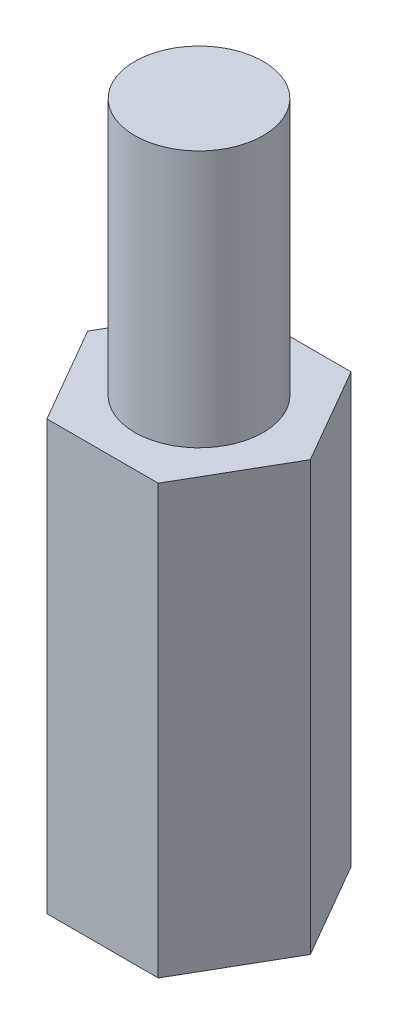
ISO-10303-21;
HEADER;
FILE_DESCRIPTION(('STEP AP214'),'2;1');
FILE_NAME('part.step','',(''),(''),'','','');
FILE_SCHEMA(('AUTOMOTIVE_DESIGN { 1 0 10303 214 1 1 1 1 }'));
ENDSEC;
DATA;
#1=APPLICATION_CONTEXT('core data for automotive mechanical design processes');
#2=APPLICATION_PROTOCOL_DEFINITION('international standard','automotive_design',2000,#1);
#3=PRODUCT_CONTEXT('',#1,'mechanical');
#4=PRODUCT('Part','Part','',(#3));
#5=PRODUCT_RELATED_PRODUCT_CATEGORY('part','',(#4));
#6=PRODUCT_DEFINITION_FORMATION('','',#4);
#7=PRODUCT_DEFINITION_CONTEXT('part definition',#1,'design');
#8=PRODUCT_DEFINITION('design','',#6,#7);
#9=PRODUCT_DEFINITION_SHAPE('','',#8);
#10=(LENGTH_UNIT() NAMED_UNIT(*) SI_UNIT(.MILLI.,.METRE.));
#11=(NAMED_UNIT(*) PLANE_ANGLE_UNIT() SI_UNIT($,.RADIAN.));
#12=(NAMED_UNIT(*) SI_UNIT($,.STERADIAN.) SOLID_ANGLE_UNIT());
#13=UNCERTAINTY_MEASURE_WITH_UNIT(LENGTH_MEASURE(1.E-05),#10,'distance_accuracy_value','');
#14=(GEOMETRIC_REPRESENTATION_CONTEXT(3) GLOBAL_UNCERTAINTY_ASSIGNED_CONTEXT((#13)) GLOBAL_UNIT_ASSIGNED_CONTEXT((#10,
#11,#12)) REPRESENTATION_CONTEXT('',''));
#15=CARTESIAN_POINT('',(0.,0.,0.));
#16=DIRECTION('',(0.,0.,1.));
#17=DIRECTION('',(1.,0.,0.));
#18=AXIS2_PLACEMENT_3D('',#15,#16,#17);
#19=CARTESIAN_POINT('',(0.,10.,0.));
#20=DIRECTION('',(0.,1.,0.));
#21=DIRECTION('',(0.,0.,1.));
#22=AXIS2_PLACEMENT_3D('',#19,#20,#21);
#23=PLANE('',#22);
#24=DIRECTION('',(0.5,0.,-0.866025403784439));
#25=VECTOR('',#24,1.);
#26=CARTESIAN_POINT('',(1.29903810567665,10.,2.25000000000001));
#27=LINE('',#26,#25);
#28=CARTESIAN_POINT('',(1.29903810567665,10.,2.25000000000001));
#29=VERTEX_POINT('',#28);
#30=CARTESIAN_POINT('',(2.59807621135331,10.,0.));
#31=VERTEX_POINT('',#30);
#32=EDGE_CURVE('E130',#29,#31,#27,.T.);
#33=ORIENTED_EDGE('',*,*,#32,.T.);
#34=DIRECTION('',(-0.499999999999999,0.,-0.866025403784439));
#35=VECTOR('',#34,1.);
#36=CARTESIAN_POINT('',(2.59807621135331,10.,0.));
#37=LINE('',#36,#35);
#38=CARTESIAN_POINT('',(1.29903810567665,10.,-2.25000000000001));
#39=VERTEX_POINT('',#38);
#40=EDGE_CURVE('E85',#31,#39,#37,.T.);
#41=ORIENTED_EDGE('',*,*,#40,.T.);
#42=DIRECTION('',(-1.,0.,0.));
#43=VECTOR('',#42,1.);
#44=CARTESIAN_POINT('',(1.29903810567665,10.,-2.25000000000001));
#45=LINE('',#44,#43);
#46=CARTESIAN_POINT('',(-1.29903810567666,10.,-2.25000000000001));
#47=VERTEX_POINT('',#46);
#48=EDGE_CURVE('E98',#39,#47,#45,.T.);
#49=ORIENTED_EDGE('',*,*,#48,.T.);
#50=DIRECTION('',(-0.5,0.,0.866025403784438));
#51=VECTOR('',#50,1.);
#52=CARTESIAN_POINT('',(-1.29903810567666,10.,-2.25000000000001));
#53=LINE('',#52,#51);
#54=CARTESIAN_POINT('',(-2.59807621135332,10.,0.));
#55=VERTEX_POINT('',#54);
#56=EDGE_CURVE('E92',#47,#55,#53,.T.);
#57=ORIENTED_EDGE('',*,*,#56,.T.);
#58=DIRECTION('',(0.500000000000001,0.,0.866025403784438));
#59=VECTOR('',#58,1.);
#60=CARTESIAN_POINT('',(-2.59807621135332,10.,0.));
#61=LINE('',#60,#59);
#62=CARTESIAN_POINT('',(-1.29903810567666,10.,2.25000000000001));
#63=VERTEX_POINT('',#62);
#64=EDGE_CURVE('E96',#55,#63,#61,.T.);
#65=ORIENTED_EDGE('',*,*,#64,.T.);
#66=DIRECTION('',(1.,0.,0.));
#67=VECTOR('',#66,1.);
#68=CARTESIAN_POINT('',(-1.29903810567666,10.,2.25000000000001));
#69=LINE('',#68,#67);
#70=EDGE_CURVE('E50',#63,#29,#69,.T.);
#71=ORIENTED_EDGE('',*,*,#70,.T.);
#72=EDGE_LOOP('',(#33,#41,#49,#57,#65,#71));
#73=FACE_BOUND('',#72,.T.);
#74=CARTESIAN_POINT('',(0.,10.,0.));
#75=DIRECTION('',(0.,1.,0.));
#76=DIRECTION('',(0.,0.,1.));
#77=AXIS2_PLACEMENT_3D('',#74,#75,#76);
#78=CIRCLE('',#77,1.5);
#79=CARTESIAN_POINT('',(0.,10.,1.5));
#80=VERTEX_POINT('',#79);
#81=EDGE_CURVE('E151',#80,#80,#78,.T.);
#82=ORIENTED_EDGE('',*,*,#81,.F.);
#83=EDGE_LOOP('',(#82));
#84=FACE_BOUND('',#83,.T.);
#85=ADVANCED_FACE('F32',(#73,#84),#23,.T.);
#86=CARTESIAN_POINT('',(0.,10.,0.));
#87=DIRECTION('',(0.,-1.,0.));
#88=DIRECTION('',(0.,0.,-1.));
#89=AXIS2_PLACEMENT_3D('',#86,#87,#88);
#90=CYLINDRICAL_SURFACE('',#89,1.5);
#91=CARTESIAN_POINT('',(0.,0.,0.));
#92=DIRECTION('',(0.,1.,0.));
#93=DIRECTION('',(0.,0.,1.));
#94=AXIS2_PLACEMENT_3D('',#91,#92,#93);
#95=CIRCLE('',#94,1.5);
#96=CARTESIAN_POINT('',(0.,0.,1.5));
#97=VERTEX_POINT('',#96);
#98=EDGE_CURVE('E119',#97,#97,#95,.T.);
#99=ORIENTED_EDGE('',*,*,#98,.F.);
#100=EDGE_LOOP('',(#99));
#101=FACE_BOUND('',#100,.T.);
#102=CARTESIAN_POINT('',(0.,7.,0.));
#103=DIRECTION('',(0.,1.,0.));
#104=DIRECTION('',(0.,0.,1.));
#105=AXIS2_PLACEMENT_3D('',#102,#103,#104);
#106=CIRCLE('',#105,1.5);
#107=CARTESIAN_POINT('',(0.,7.,1.5));
#108=VERTEX_POINT('',#107);
#109=EDGE_CURVE('E36',#108,#108,#106,.T.);
#110=ORIENTED_EDGE('',*,*,#109,.T.);
#111=EDGE_LOOP('',(#110));
#112=FACE_BOUND('',#111,.T.);
#113=ADVANCED_FACE('F161',(#101,#112),#90,.F.);
#114=CARTESIAN_POINT('',(0.,0.,0.));
#115=DIRECTION('',(0.,1.,0.));
#116=DIRECTION('',(0.,0.,1.));
#117=AXIS2_PLACEMENT_3D('',#114,#115,#116);
#118=PLANE('',#117);
#119=DIRECTION('',(0.5,0.,-0.866025403784439));
#120=VECTOR('',#119,1.);
#121=CARTESIAN_POINT('',(1.29903810567665,0.,2.25000000000001));
#122=LINE('',#121,#120);
#123=CARTESIAN_POINT('',(1.29903810567665,0.,2.25000000000001));
#124=VERTEX_POINT('',#123);
#125=CARTESIAN_POINT('',(2.59807621135331,0.,0.));
#126=VERTEX_POINT('',#125);
#127=EDGE_CURVE('E116',#124,#126,#122,.T.);
#128=ORIENTED_EDGE('',*,*,#127,.F.);
#129=DIRECTION('',(1.,0.,0.));
#130=VECTOR('',#129,1.);
#131=CARTESIAN_POINT('',(-1.29903810567666,0.,2.25000000000001));
#132=LINE('',#131,#130);
#133=CARTESIAN_POINT('',(-1.29903810567666,0.,2.25000000000001));
#134=VERTEX_POINT('',#133);
#135=EDGE_CURVE('E128',#134,#124,#132,.T.);
#136=ORIENTED_EDGE('',*,*,#135,.F.);
#137=DIRECTION('',(0.500000000000001,0.,0.866025403784438));
#138=VECTOR('',#137,1.);
#139=CARTESIAN_POINT('',(-2.59807621135332,0.,0.));
#140=LINE('',#139,#138);
#141=CARTESIAN_POINT('',(-2.59807621135332,0.,0.));
#142=VERTEX_POINT('',#141);
#143=EDGE_CURVE('E126',#142,#134,#140,.T.);
#144=ORIENTED_EDGE('',*,*,#143,.F.);
#145=DIRECTION('',(-0.5,0.,0.866025403784438));
#146=VECTOR('',#145,1.);
#147=CARTESIAN_POINT('',(-1.29903810567666,0.,-2.25000000000001));
#148=LINE('',#147,#146);
#149=CARTESIAN_POINT('',(-1.29903810567666,0.,-2.25000000000001));
#150=VERTEX_POINT('',#149);
#151=EDGE_CURVE('E106',#150,#142,#148,.T.);
#152=ORIENTED_EDGE('',*,*,#151,.F.);
#153=DIRECTION('',(-1.,0.,0.));
#154=VECTOR('',#153,1.);
#155=CARTESIAN_POINT('',(1.29903810567665,0.,-2.25000000000001));
#156=LINE('',#155,#154);
#157=CARTESIAN_POINT('',(1.29903810567665,0.,-2.25000000000001));
#158=VERTEX_POINT('',#157);
#159=EDGE_CURVE('E122',#158,#150,#156,.T.);
#160=ORIENTED_EDGE('',*,*,#159,.F.);
#161=DIRECTION('',(-0.499999999999999,0.,-0.866025403784439));
#162=VECTOR('',#161,1.);
#163=CARTESIAN_POINT('',(2.59807621135331,0.,0.));
#164=LINE('',#163,#162);
#165=EDGE_CURVE('E118',#126,#158,#164,.T.);
#166=ORIENTED_EDGE('',*,*,#165,.F.);
#167=EDGE_LOOP('',(#128,#136,#144,#152,#160,#166));
#168=FACE_BOUND('',#167,.T.);
#169=ORIENTED_EDGE('',*,*,#98,.T.);
#170=EDGE_LOOP('',(#169));
#171=FACE_BOUND('',#170,.T.);
#172=ADVANCED_FACE('F142',(#168,#171),#118,.F.);
#173=CARTESIAN_POINT('',(1.29903810567665,10.,2.25000000000001));
#174=DIRECTION('',(-0.866025403784439,0.,-0.5));
#175=DIRECTION('',(-0.5,0.,0.866025403784439));
#176=AXIS2_PLACEMENT_3D('',#173,#174,#175);
#177=PLANE('',#176);
#178=DIRECTION('',(0.,-1.,0.));
#179=VECTOR('',#178,1.);
#180=CARTESIAN_POINT('',(1.29903810567665,10.,2.25000000000001));
#181=LINE('',#180,#179);
#182=EDGE_CURVE('E78',#29,#124,#181,.T.);
#183=ORIENTED_EDGE('',*,*,#182,.T.);
#184=ORIENTED_EDGE('',*,*,#127,.T.);
#185=DIRECTION('',(0.,-1.,0.));
#186=VECTOR('',#185,1.);
#187=CARTESIAN_POINT('',(2.59807621135331,10.,0.));
#188=LINE('',#187,#186);
#189=EDGE_CURVE('E11',#31,#126,#188,.T.);
#190=ORIENTED_EDGE('',*,*,#189,.F.);
#191=ORIENTED_EDGE('',*,*,#32,.F.);
#192=EDGE_LOOP('',(#183,#184,#190,#191));
#193=FACE_BOUND('',#192,.T.);
#194=ADVANCED_FACE('F34',(#193),#177,.F.);
#195=CARTESIAN_POINT('',(2.59807621135331,10.,0.));
#196=DIRECTION('',(-0.866025403784439,0.,0.499999999999999));
#197=DIRECTION('',(0.499999999999999,0.,0.866025403784439));
#198=AXIS2_PLACEMENT_3D('',#195,#196,#197);
#199=PLANE('',#198);
#200=ORIENTED_EDGE('',*,*,#189,.T.);
#201=ORIENTED_EDGE('',*,*,#165,.T.);
#202=DIRECTION('',(0.,-1.,0.));
#203=VECTOR('',#202,1.);
#204=CARTESIAN_POINT('',(1.29903810567665,10.,-2.25000000000001));
#205=LINE('',#204,#203);
#206=EDGE_CURVE('E42',#39,#158,#205,.T.);
#207=ORIENTED_EDGE('',*,*,#206,.F.);
#208=ORIENTED_EDGE('',*,*,#40,.F.);
#209=EDGE_LOOP('',(#200,#201,#207,#208));
#210=FACE_BOUND('',#209,.T.);
#211=ADVANCED_FACE('F138',(#210),#199,.F.);
#212=CARTESIAN_POINT('',(1.29903810567665,10.,-2.25000000000001));
#213=DIRECTION('',(0.,0.,1.));
#214=DIRECTION('',(1.,0.,0.));
#215=AXIS2_PLACEMENT_3D('',#212,#213,#214);
#216=PLANE('',#215);
#217=ORIENTED_EDGE('',*,*,#206,.T.);
#218=ORIENTED_EDGE('',*,*,#159,.T.);
#219=DIRECTION('',(0.,-1.,0.));
#220=VECTOR('',#219,1.);
#221=CARTESIAN_POINT('',(-1.29903810567666,10.,-2.25000000000001));
#222=LINE('',#221,#220);
#223=EDGE_CURVE('E109',#47,#150,#222,.T.);
#224=ORIENTED_EDGE('',*,*,#223,.F.);
#225=ORIENTED_EDGE('',*,*,#48,.F.);
#226=EDGE_LOOP('',(#217,#218,#224,#225));
#227=FACE_BOUND('',#226,.T.);
#228=ADVANCED_FACE('F135',(#227),#216,.F.);
#229=CARTESIAN_POINT('',(-1.29903810567666,10.,-2.25000000000001));
#230=DIRECTION('',(0.866025403784438,0.,0.5));
#231=DIRECTION('',(0.5,0.,-0.866025403784438));
#232=AXIS2_PLACEMENT_3D('',#229,#230,#231);
#233=PLANE('',#232);
#234=ORIENTED_EDGE('',*,*,#223,.T.);
#235=ORIENTED_EDGE('',*,*,#151,.T.);
#236=DIRECTION('',(0.,-1.,0.));
#237=VECTOR('',#236,1.);
#238=CARTESIAN_POINT('',(-2.59807621135332,10.,0.));
#239=LINE('',#238,#237);
#240=EDGE_CURVE('E103',#55,#142,#239,.T.);
#241=ORIENTED_EDGE('',*,*,#240,.F.);
#242=ORIENTED_EDGE('',*,*,#56,.F.);
#243=EDGE_LOOP('',(#234,#235,#241,#242));
#244=FACE_BOUND('',#243,.T.);
#245=ADVANCED_FACE('F104',(#244),#233,.F.);
#246=CARTESIAN_POINT('',(-2.59807621135332,10.,0.));
#247=DIRECTION('',(0.866025403784438,0.,-0.500000000000001));
#248=DIRECTION('',(-0.500000000000001,0.,-0.866025403784438));
#249=AXIS2_PLACEMENT_3D('',#246,#247,#248);
#250=PLANE('',#249);
#251=ORIENTED_EDGE('',*,*,#240,.T.);
#252=ORIENTED_EDGE('',*,*,#143,.T.);
#253=DIRECTION('',(0.,-1.,0.));
#254=VECTOR('',#253,1.);
#255=CARTESIAN_POINT('',(-1.29903810567666,10.,2.25000000000001));
#256=LINE('',#255,#254);
#257=EDGE_CURVE('E71',#63,#134,#256,.T.);
#258=ORIENTED_EDGE('',*,*,#257,.F.);
#259=ORIENTED_EDGE('',*,*,#64,.F.);
#260=EDGE_LOOP('',(#251,#252,#258,#259));
#261=FACE_BOUND('',#260,.T.);
#262=ADVANCED_FACE('F111',(#261),#250,.F.);
#263=CARTESIAN_POINT('',(-1.29903810567666,10.,2.25000000000001));
#264=DIRECTION('',(0.,0.,-1.));
#265=DIRECTION('',(-1.,0.,0.));
#266=AXIS2_PLACEMENT_3D('',#263,#264,#265);
#267=PLANE('',#266);
#268=ORIENTED_EDGE('',*,*,#257,.T.);
#269=ORIENTED_EDGE('',*,*,#135,.T.);
#270=ORIENTED_EDGE('',*,*,#182,.F.);
#271=ORIENTED_EDGE('',*,*,#70,.F.);
#272=EDGE_LOOP('',(#268,#269,#270,#271));
#273=FACE_BOUND('',#272,.T.);
#274=ADVANCED_FACE('F145',(#273),#267,.F.);
#275=CARTESIAN_POINT('',(0.,7.,0.));
#276=DIRECTION('',(0.,1.,0.));
#277=DIRECTION('',(0.,0.,1.));
#278=AXIS2_PLACEMENT_3D('',#275,#276,#277);
#279=PLANE('',#278);
#280=ORIENTED_EDGE('',*,*,#109,.F.);
#281=EDGE_LOOP('',(#280));
#282=FACE_BOUND('',#281,.T.);
#283=ADVANCED_FACE('F163',(#282),#279,.F.);
#284=CARTESIAN_POINT('',(0.,16.,0.));
#285=DIRECTION('',(0.,-1.,0.));
#286=DIRECTION('',(0.,0.,-1.));
#287=AXIS2_PLACEMENT_3D('',#284,#285,#286);
#288=CYLINDRICAL_SURFACE('',#287,1.5);
#289=CARTESIAN_POINT('',(0.,16.,0.));
#290=DIRECTION('',(0.,1.,0.));
#291=DIRECTION('',(0.,0.,1.));
#292=AXIS2_PLACEMENT_3D('',#289,#290,#291);
#293=CIRCLE('',#292,1.5);
#294=CARTESIAN_POINT('',(0.,16.,1.5));
#295=VERTEX_POINT('',#294);
#296=EDGE_CURVE('E154',#295,#295,#293,.T.);
#297=ORIENTED_EDGE('',*,*,#296,.F.);
#298=EDGE_LOOP('',(#297));
#299=FACE_BOUND('',#298,.T.);
#300=ORIENTED_EDGE('',*,*,#81,.T.);
#301=EDGE_LOOP('',(#300));
#302=FACE_BOUND('',#301,.T.);
#303=ADVANCED_FACE('F165',(#299,#302),#288,.T.);
#304=CARTESIAN_POINT('',(0.,16.,0.));
#305=DIRECTION('',(0.,1.,0.));
#306=DIRECTION('',(0.,0.,1.));
#307=AXIS2_PLACEMENT_3D('',#304,#305,#306);
#308=PLANE('',#307);
#309=ORIENTED_EDGE('',*,*,#296,.T.);
#310=EDGE_LOOP('',(#309));
#311=FACE_BOUND('',#310,.T.);
#312=ADVANCED_FACE('F171',(#311),#308,.T.);
#313=CLOSED_SHELL('',(#85,#113,#172,#194,#211,#228,#245,#262,#274,#283,#303,#312));
#314=MANIFOLD_SOLID_BREP('B2',#313);
#315=ADVANCED_BREP_SHAPE_REPRESENTATION('',(#18,#314),#14);
#316=SHAPE_DEFINITION_REPRESENTATION(#9,#315);
ENDSEC;
END-ISO-10303-21;
